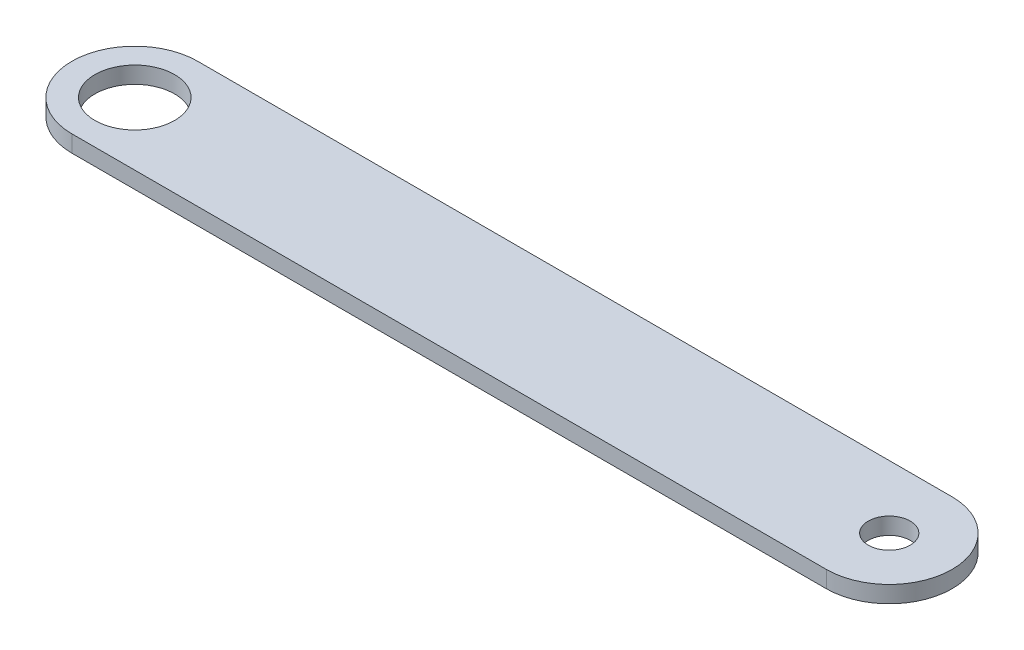
ISO-10303-21;
HEADER;
FILE_DESCRIPTION(('STEP AP214'),'2;1');
FILE_NAME('part.step','',(''),(''),'','','');
FILE_SCHEMA(('AUTOMOTIVE_DESIGN { 1 0 10303 214 1 1 1 1 }'));
ENDSEC;
DATA;
#1=APPLICATION_CONTEXT('core data for automotive mechanical design processes');
#2=APPLICATION_PROTOCOL_DEFINITION('international standard','automotive_design',2000,#1);
#3=PRODUCT_CONTEXT('',#1,'mechanical');
#4=PRODUCT('Part','Part','',(#3));
#5=PRODUCT_RELATED_PRODUCT_CATEGORY('part','',(#4));
#6=PRODUCT_DEFINITION_FORMATION('','',#4);
#7=PRODUCT_DEFINITION_CONTEXT('part definition',#1,'design');
#8=PRODUCT_DEFINITION('design','',#6,#7);
#9=PRODUCT_DEFINITION_SHAPE('','',#8);
#10=(LENGTH_UNIT() NAMED_UNIT(*) SI_UNIT(.MILLI.,.METRE.));
#11=(NAMED_UNIT(*) PLANE_ANGLE_UNIT() SI_UNIT($,.RADIAN.));
#12=(NAMED_UNIT(*) SI_UNIT($,.STERADIAN.) SOLID_ANGLE_UNIT());
#13=UNCERTAINTY_MEASURE_WITH_UNIT(LENGTH_MEASURE(1.E-05),#10,'distance_accuracy_value','');
#14=(GEOMETRIC_REPRESENTATION_CONTEXT(3) GLOBAL_UNCERTAINTY_ASSIGNED_CONTEXT((#13)) GLOBAL_UNIT_ASSIGNED_CONTEXT((#10,
#11,#12)) REPRESENTATION_CONTEXT('',''));
#15=CARTESIAN_POINT('',(0.,0.,0.));
#16=DIRECTION('',(0.,0.,1.));
#17=DIRECTION('',(1.,0.,0.));
#18=AXIS2_PLACEMENT_3D('',#15,#16,#17);
#19=CARTESIAN_POINT('',(0.,4.,0.));
#20=DIRECTION('',(0.,-1.,0.));
#21=DIRECTION('',(0.,0.,-1.));
#22=AXIS2_PLACEMENT_3D('',#19,#20,#21);
#23=CYLINDRICAL_SURFACE('',#22,15.);
#24=CARTESIAN_POINT('',(0.,0.,0.));
#25=DIRECTION('',(0.,1.,0.));
#26=DIRECTION('',(0.,0.,1.));
#27=AXIS2_PLACEMENT_3D('',#24,#25,#26);
#28=CIRCLE('',#27,15.);
#29=CARTESIAN_POINT('',(0.,0.,15.));
#30=VERTEX_POINT('',#29);
#31=CARTESIAN_POINT('',(0.,0.,-15.));
#32=VERTEX_POINT('',#31);
#33=EDGE_CURVE('E103',#30,#32,#28,.T.);
#34=ORIENTED_EDGE('',*,*,#33,.T.);
#35=DIRECTION('',(0.,-1.,0.));
#36=VECTOR('',#35,1.);
#37=CARTESIAN_POINT('',(0.,4.,-15.));
#38=LINE('',#37,#36);
#39=CARTESIAN_POINT('',(0.,4.,-15.));
#40=VERTEX_POINT('',#39);
#41=EDGE_CURVE('E11',#40,#32,#38,.T.);
#42=ORIENTED_EDGE('',*,*,#41,.F.);
#43=CARTESIAN_POINT('',(0.,4.,0.));
#44=DIRECTION('',(0.,1.,0.));
#45=DIRECTION('',(0.,0.,1.));
#46=AXIS2_PLACEMENT_3D('',#43,#44,#45);
#47=CIRCLE('',#46,15.);
#48=CARTESIAN_POINT('',(0.,4.,15.));
#49=VERTEX_POINT('',#48);
#50=EDGE_CURVE('E93',#49,#40,#47,.T.);
#51=ORIENTED_EDGE('',*,*,#50,.F.);
#52=DIRECTION('',(0.,-1.,0.));
#53=VECTOR('',#52,1.);
#54=CARTESIAN_POINT('',(0.,4.,15.));
#55=LINE('',#54,#53);
#56=EDGE_CURVE('E97',#49,#30,#55,.T.);
#57=ORIENTED_EDGE('',*,*,#56,.T.);
#58=EDGE_LOOP('',(#34,#42,#51,#57));
#59=FACE_BOUND('',#58,.T.);
#60=ADVANCED_FACE('F37',(#59),#23,.T.);
#61=CARTESIAN_POINT('',(0.,4.,-15.));
#62=DIRECTION('',(0.,0.,1.));
#63=DIRECTION('',(1.,0.,0.));
#64=AXIS2_PLACEMENT_3D('',#61,#62,#63);
#65=PLANE('',#64);
#66=DIRECTION('',(-1.,0.,0.));
#67=VECTOR('',#66,1.);
#68=CARTESIAN_POINT('',(0.,0.,-15.));
#69=LINE('',#68,#67);
#70=CARTESIAN_POINT('',(-180.,0.,-15.));
#71=VERTEX_POINT('',#70);
#72=EDGE_CURVE('E92',#32,#71,#69,.T.);
#73=ORIENTED_EDGE('',*,*,#72,.T.);
#74=DIRECTION('',(0.,-1.,0.));
#75=VECTOR('',#74,1.);
#76=CARTESIAN_POINT('',(-180.,4.,-15.));
#77=LINE('',#76,#75);
#78=CARTESIAN_POINT('',(-180.,4.,-15.));
#79=VERTEX_POINT('',#78);
#80=EDGE_CURVE('E48',#79,#71,#77,.T.);
#81=ORIENTED_EDGE('',*,*,#80,.F.);
#82=DIRECTION('',(-1.,0.,0.));
#83=VECTOR('',#82,1.);
#84=CARTESIAN_POINT('',(0.,4.,-15.));
#85=LINE('',#84,#83);
#86=EDGE_CURVE('E88',#40,#79,#85,.T.);
#87=ORIENTED_EDGE('',*,*,#86,.F.);
#88=ORIENTED_EDGE('',*,*,#41,.T.);
#89=EDGE_LOOP('',(#73,#81,#87,#88));
#90=FACE_BOUND('',#89,.T.);
#91=ADVANCED_FACE('F94',(#90),#65,.F.);
#92=CARTESIAN_POINT('',(-180.,4.,0.));
#93=DIRECTION('',(0.,-1.,0.));
#94=DIRECTION('',(0.,0.,-1.));
#95=AXIS2_PLACEMENT_3D('',#92,#93,#94);
#96=CYLINDRICAL_SURFACE('',#95,15.);
#97=CARTESIAN_POINT('',(-180.,0.,0.));
#98=DIRECTION('',(0.,1.,0.));
#99=DIRECTION('',(0.,0.,1.));
#100=AXIS2_PLACEMENT_3D('',#97,#98,#99);
#101=CIRCLE('',#100,15.);
#102=CARTESIAN_POINT('',(-180.,0.,15.));
#103=VERTEX_POINT('',#102);
#104=EDGE_CURVE('E71',#71,#103,#101,.T.);
#105=ORIENTED_EDGE('',*,*,#104,.T.);
#106=DIRECTION('',(0.,-1.,0.));
#107=VECTOR('',#106,1.);
#108=CARTESIAN_POINT('',(-180.,4.,15.));
#109=LINE('',#108,#107);
#110=CARTESIAN_POINT('',(-180.,4.,15.));
#111=VERTEX_POINT('',#110);
#112=EDGE_CURVE('E96',#111,#103,#109,.T.);
#113=ORIENTED_EDGE('',*,*,#112,.F.);
#114=CARTESIAN_POINT('',(-180.,4.,0.));
#115=DIRECTION('',(0.,1.,0.));
#116=DIRECTION('',(0.,0.,1.));
#117=AXIS2_PLACEMENT_3D('',#114,#115,#116);
#118=CIRCLE('',#117,15.);
#119=EDGE_CURVE('E90',#79,#111,#118,.T.);
#120=ORIENTED_EDGE('',*,*,#119,.F.);
#121=ORIENTED_EDGE('',*,*,#80,.T.);
#122=EDGE_LOOP('',(#105,#113,#120,#121));
#123=FACE_BOUND('',#122,.T.);
#124=ADVANCED_FACE('F100',(#123),#96,.T.);
#125=CARTESIAN_POINT('',(0.,4.,15.));
#126=DIRECTION('',(0.,0.,-1.));
#127=DIRECTION('',(-1.,0.,0.));
#128=AXIS2_PLACEMENT_3D('',#125,#126,#127);
#129=PLANE('',#128);
#130=DIRECTION('',(1.,0.,0.));
#131=VECTOR('',#130,1.);
#132=CARTESIAN_POINT('',(0.,0.,15.));
#133=LINE('',#132,#131);
#134=EDGE_CURVE('E77',#103,#30,#133,.T.);
#135=ORIENTED_EDGE('',*,*,#134,.T.);
#136=ORIENTED_EDGE('',*,*,#56,.F.);
#137=DIRECTION('',(1.,0.,0.));
#138=VECTOR('',#137,1.);
#139=CARTESIAN_POINT('',(0.,4.,15.));
#140=LINE('',#139,#138);
#141=EDGE_CURVE('E57',#111,#49,#140,.T.);
#142=ORIENTED_EDGE('',*,*,#141,.F.);
#143=ORIENTED_EDGE('',*,*,#112,.T.);
#144=EDGE_LOOP('',(#135,#136,#142,#143));
#145=FACE_BOUND('',#144,.T.);
#146=ADVANCED_FACE('F112',(#145),#129,.F.);
#147=CARTESIAN_POINT('',(0.,4.,0.));
#148=DIRECTION('',(0.,1.,0.));
#149=DIRECTION('',(0.,0.,1.));
#150=AXIS2_PLACEMENT_3D('',#147,#148,#149);
#151=PLANE('',#150);
#152=CARTESIAN_POINT('',(0.,4.,0.));
#153=DIRECTION('',(0.,1.,0.));
#154=DIRECTION('',(0.,0.,1.));
#155=AXIS2_PLACEMENT_3D('',#152,#153,#154);
#156=CIRCLE('',#155,5.);
#157=CARTESIAN_POINT('',(0.,4.,5.));
#158=VERTEX_POINT('',#157);
#159=EDGE_CURVE('E125',#158,#158,#156,.T.);
#160=ORIENTED_EDGE('',*,*,#159,.F.);
#161=EDGE_LOOP('',(#160));
#162=FACE_BOUND('',#161,.T.);
#163=CARTESIAN_POINT('',(-180.,4.,0.));
#164=DIRECTION('',(0.,1.,0.));
#165=DIRECTION('',(0.,0.,1.));
#166=AXIS2_PLACEMENT_3D('',#163,#164,#165);
#167=CIRCLE('',#166,9.50000000000001);
#168=CARTESIAN_POINT('',(-180.,4.,9.50000000000003));
#169=VERTEX_POINT('',#168);
#170=EDGE_CURVE('E119',#169,#169,#167,.T.);
#171=ORIENTED_EDGE('',*,*,#170,.F.);
#172=EDGE_LOOP('',(#171));
#173=FACE_BOUND('',#172,.T.);
#174=ORIENTED_EDGE('',*,*,#50,.T.);
#175=ORIENTED_EDGE('',*,*,#86,.T.);
#176=ORIENTED_EDGE('',*,*,#119,.T.);
#177=ORIENTED_EDGE('',*,*,#141,.T.);
#178=EDGE_LOOP('',(#174,#175,#176,#177));
#179=FACE_BOUND('',#178,.T.);
#180=ADVANCED_FACE('F87',(#162,#173,#179),#151,.T.);
#181=CARTESIAN_POINT('',(0.,0.,0.));
#182=DIRECTION('',(0.,1.,0.));
#183=DIRECTION('',(0.,0.,1.));
#184=AXIS2_PLACEMENT_3D('',#181,#182,#183);
#185=PLANE('',#184);
#186=CARTESIAN_POINT('',(0.,0.,0.));
#187=DIRECTION('',(0.,1.,0.));
#188=DIRECTION('',(0.,0.,1.));
#189=AXIS2_PLACEMENT_3D('',#186,#187,#188);
#190=CIRCLE('',#189,5.);
#191=CARTESIAN_POINT('',(0.,0.,5.));
#192=VERTEX_POINT('',#191);
#193=EDGE_CURVE('E106',#192,#192,#190,.T.);
#194=ORIENTED_EDGE('',*,*,#193,.T.);
#195=EDGE_LOOP('',(#194));
#196=FACE_BOUND('',#195,.T.);
#197=CARTESIAN_POINT('',(-180.,0.,0.));
#198=DIRECTION('',(0.,1.,0.));
#199=DIRECTION('',(0.,0.,1.));
#200=AXIS2_PLACEMENT_3D('',#197,#198,#199);
#201=CIRCLE('',#200,9.50000000000001);
#202=CARTESIAN_POINT('',(-180.,0.,9.50000000000003));
#203=VERTEX_POINT('',#202);
#204=EDGE_CURVE('E120',#203,#203,#201,.T.);
#205=ORIENTED_EDGE('',*,*,#204,.T.);
#206=EDGE_LOOP('',(#205));
#207=FACE_BOUND('',#206,.T.);
#208=ORIENTED_EDGE('',*,*,#33,.F.);
#209=ORIENTED_EDGE('',*,*,#134,.F.);
#210=ORIENTED_EDGE('',*,*,#104,.F.);
#211=ORIENTED_EDGE('',*,*,#72,.F.);
#212=EDGE_LOOP('',(#208,#209,#210,#211));
#213=FACE_BOUND('',#212,.T.);
#214=ADVANCED_FACE('F111',(#196,#207,#213),#185,.F.);
#215=CARTESIAN_POINT('',(-180.,0.,0.));
#216=DIRECTION('',(0.,1.,0.));
#217=DIRECTION('',(0.,0.,1.));
#218=AXIS2_PLACEMENT_3D('',#215,#216,#217);
#219=CYLINDRICAL_SURFACE('',#218,9.50000000000001);
#220=ORIENTED_EDGE('',*,*,#204,.F.);
#221=EDGE_LOOP('',(#220));
#222=FACE_BOUND('',#221,.T.);
#223=ORIENTED_EDGE('',*,*,#170,.T.);
#224=EDGE_LOOP('',(#223));
#225=FACE_BOUND('',#224,.T.);
#226=ADVANCED_FACE('F132',(#222,#225),#219,.F.);
#227=CARTESIAN_POINT('',(0.,0.,0.));
#228=DIRECTION('',(0.,1.,0.));
#229=DIRECTION('',(0.,0.,1.));
#230=AXIS2_PLACEMENT_3D('',#227,#228,#229);
#231=CYLINDRICAL_SURFACE('',#230,5.);
#232=ORIENTED_EDGE('',*,*,#193,.F.);
#233=EDGE_LOOP('',(#232));
#234=FACE_BOUND('',#233,.T.);
#235=ORIENTED_EDGE('',*,*,#159,.T.);
#236=EDGE_LOOP('',(#235));
#237=FACE_BOUND('',#236,.T.);
#238=ADVANCED_FACE('F133',(#234,#237),#231,.F.);
#239=CLOSED_SHELL('',(#60,#91,#124,#146,#180,#214,#226,#238));
#240=MANIFOLD_SOLID_BREP('B2',#239);
#241=ADVANCED_BREP_SHAPE_REPRESENTATION('',(#18,#240),#14);
#242=SHAPE_DEFINITION_REPRESENTATION(#9,#241);
ENDSEC;
END-ISO-10303-21;
